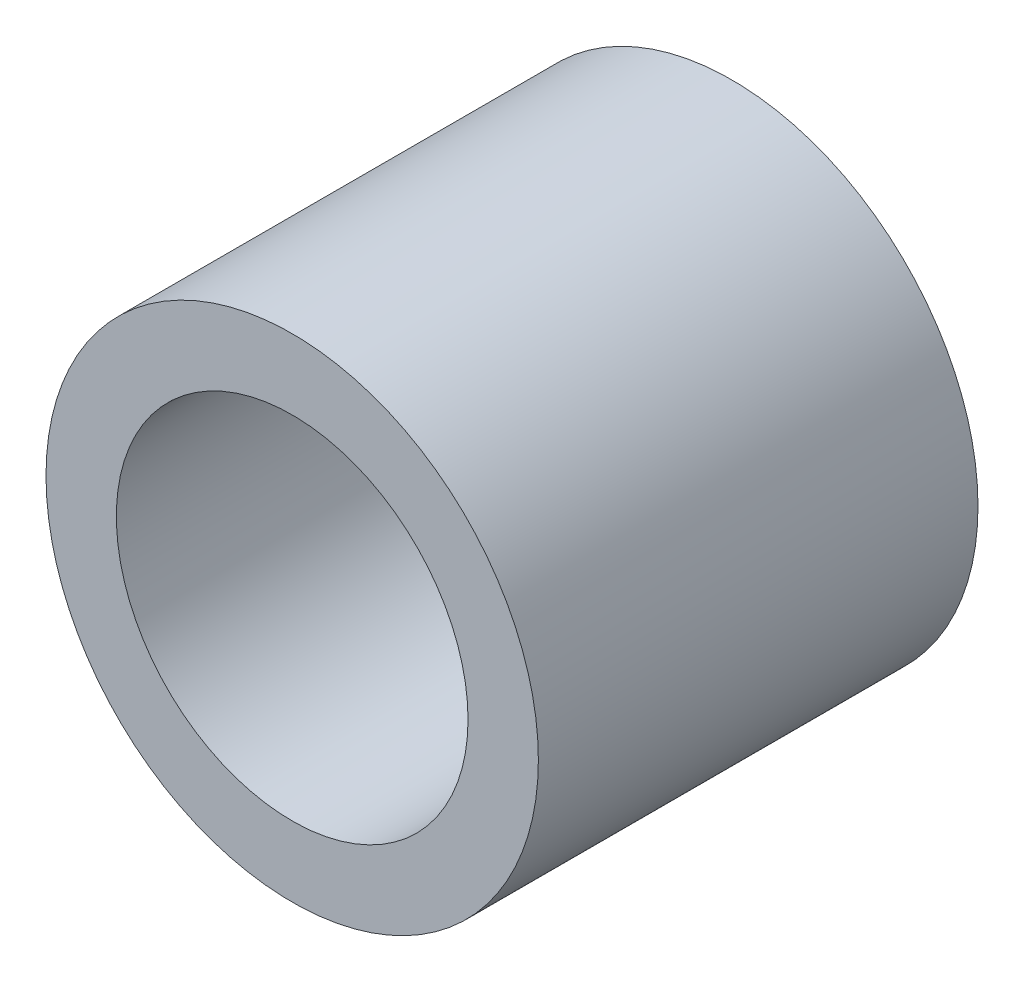
ISO-10303-21;
HEADER;
FILE_DESCRIPTION(('STEP AP214'),'2;1');
FILE_NAME('part.step','',(''),(''),'','','');
FILE_SCHEMA(('AUTOMOTIVE_DESIGN { 1 0 10303 214 1 1 1 1 }'));
ENDSEC;
DATA;
#1=APPLICATION_CONTEXT('core data for automotive mechanical design processes');
#2=APPLICATION_PROTOCOL_DEFINITION('international standard','automotive_design',2000,#1);
#3=PRODUCT_CONTEXT('',#1,'mechanical');
#4=PRODUCT('Part','Part','',(#3));
#5=PRODUCT_RELATED_PRODUCT_CATEGORY('part','',(#4));
#6=PRODUCT_DEFINITION_FORMATION('','',#4);
#7=PRODUCT_DEFINITION_CONTEXT('part definition',#1,'design');
#8=PRODUCT_DEFINITION('design','',#6,#7);
#9=PRODUCT_DEFINITION_SHAPE('','',#8);
#10=(LENGTH_UNIT() NAMED_UNIT(*) SI_UNIT(.MILLI.,.METRE.));
#11=(NAMED_UNIT(*) PLANE_ANGLE_UNIT() SI_UNIT($,.RADIAN.));
#12=(NAMED_UNIT(*) SI_UNIT($,.STERADIAN.) SOLID_ANGLE_UNIT());
#13=UNCERTAINTY_MEASURE_WITH_UNIT(LENGTH_MEASURE(1.E-05),#10,'distance_accuracy_value','');
#14=(GEOMETRIC_REPRESENTATION_CONTEXT(3) GLOBAL_UNCERTAINTY_ASSIGNED_CONTEXT((#13)) GLOBAL_UNIT_ASSIGNED_CONTEXT((#10,
#11,#12)) REPRESENTATION_CONTEXT('',''));
#15=CARTESIAN_POINT('',(0.,0.,0.));
#16=DIRECTION('',(0.,0.,1.));
#17=DIRECTION('',(1.,0.,0.));
#18=AXIS2_PLACEMENT_3D('',#15,#16,#17);
#19=CARTESIAN_POINT('',(0.,0.,7.9375));
#20=DIRECTION('',(0.,0.,1.));
#21=DIRECTION('',(1.,0.,0.));
#22=AXIS2_PLACEMENT_3D('',#19,#20,#21);
#23=PLANE('',#22);
#24=CARTESIAN_POINT('',(0.,0.,7.9375));
#25=DIRECTION('',(0.,0.,1.));
#26=DIRECTION('',(1.,0.,0.));
#27=AXIS2_PLACEMENT_3D('',#24,#25,#26);
#28=CIRCLE('',#27,4.445);
#29=CARTESIAN_POINT('',(4.445,0.,7.9375));
#30=VERTEX_POINT('',#29);
#31=EDGE_CURVE('E10',#30,#30,#28,.T.);
#32=ORIENTED_EDGE('',*,*,#31,.T.);
#33=EDGE_LOOP('',(#32));
#34=FACE_BOUND('',#33,.T.);
#35=CARTESIAN_POINT('',(0.,0.,7.9375));
#36=DIRECTION('',(0.,0.,1.));
#37=DIRECTION('',(1.,0.,0.));
#38=AXIS2_PLACEMENT_3D('',#35,#36,#37);
#39=CIRCLE('',#38,3.175);
#40=CARTESIAN_POINT('',(3.175,0.,7.9375));
#41=VERTEX_POINT('',#40);
#42=EDGE_CURVE('E56',#41,#41,#39,.T.);
#43=ORIENTED_EDGE('',*,*,#42,.F.);
#44=EDGE_LOOP('',(#43));
#45=FACE_BOUND('',#44,.T.);
#46=ADVANCED_FACE('F43',(#34,#45),#23,.T.);
#47=CARTESIAN_POINT('',(0.,0.,0.));
#48=DIRECTION('',(0.,0.,1.));
#49=DIRECTION('',(1.,0.,0.));
#50=AXIS2_PLACEMENT_3D('',#47,#48,#49);
#51=PLANE('',#50);
#52=CARTESIAN_POINT('',(0.,0.,0.));
#53=DIRECTION('',(0.,0.,1.));
#54=DIRECTION('',(1.,0.,0.));
#55=AXIS2_PLACEMENT_3D('',#52,#53,#54);
#56=CIRCLE('',#55,4.445);
#57=CARTESIAN_POINT('',(4.445,0.,0.));
#58=VERTEX_POINT('',#57);
#59=EDGE_CURVE('E47',#58,#58,#56,.T.);
#60=ORIENTED_EDGE('',*,*,#59,.F.);
#61=EDGE_LOOP('',(#60));
#62=FACE_BOUND('',#61,.T.);
#63=CARTESIAN_POINT('',(0.,0.,0.));
#64=DIRECTION('',(0.,0.,1.));
#65=DIRECTION('',(1.,0.,0.));
#66=AXIS2_PLACEMENT_3D('',#63,#64,#65);
#67=CIRCLE('',#66,3.175);
#68=CARTESIAN_POINT('',(3.175,0.,0.));
#69=VERTEX_POINT('',#68);
#70=EDGE_CURVE('E58',#69,#69,#67,.T.);
#71=ORIENTED_EDGE('',*,*,#70,.T.);
#72=EDGE_LOOP('',(#71));
#73=FACE_BOUND('',#72,.T.);
#74=ADVANCED_FACE('F70',(#62,#73),#51,.F.);
#75=CARTESIAN_POINT('',(0.,0.,7.9375));
#76=DIRECTION('',(0.,0.,-1.));
#77=DIRECTION('',(-1.,0.,0.));
#78=AXIS2_PLACEMENT_3D('',#75,#76,#77);
#79=CYLINDRICAL_SURFACE('',#78,4.445);
#80=ORIENTED_EDGE('',*,*,#31,.F.);
#81=EDGE_LOOP('',(#80));
#82=FACE_BOUND('',#81,.T.);
#83=ORIENTED_EDGE('',*,*,#59,.T.);
#84=EDGE_LOOP('',(#83));
#85=FACE_BOUND('',#84,.T.);
#86=ADVANCED_FACE('F45',(#82,#85),#79,.T.);
#87=CARTESIAN_POINT('',(0.,0.,7.9375));
#88=DIRECTION('',(0.,0.,-1.));
#89=DIRECTION('',(-1.,0.,0.));
#90=AXIS2_PLACEMENT_3D('',#87,#88,#89);
#91=CYLINDRICAL_SURFACE('',#90,3.175);
#92=ORIENTED_EDGE('',*,*,#42,.T.);
#93=EDGE_LOOP('',(#92));
#94=FACE_BOUND('',#93,.T.);
#95=ORIENTED_EDGE('',*,*,#70,.F.);
#96=EDGE_LOOP('',(#95));
#97=FACE_BOUND('',#96,.T.);
#98=ADVANCED_FACE('F66',(#94,#97),#91,.F.);
#99=CLOSED_SHELL('',(#46,#74,#86,#98));
#100=MANIFOLD_SOLID_BREP('B2',#99);
#101=ADVANCED_BREP_SHAPE_REPRESENTATION('',(#18,#100),#14);
#102=SHAPE_DEFINITION_REPRESENTATION(#9,#101);
ENDSEC;
END-ISO-10303-21;
